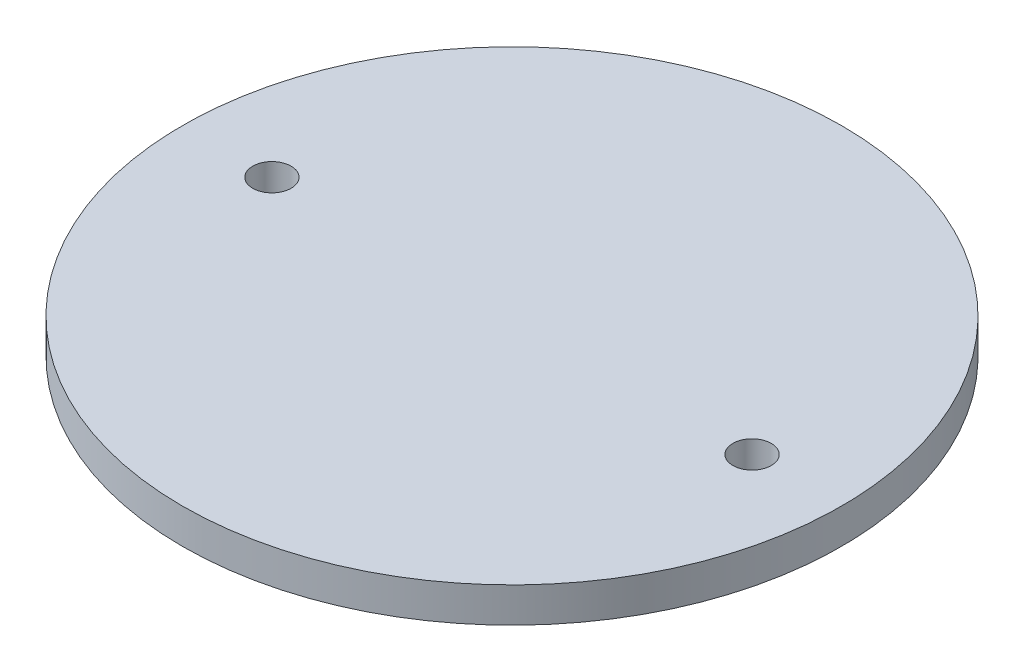
ISO-10303-21;
HEADER;
FILE_DESCRIPTION(('STEP AP214'),'2;1');
FILE_NAME('part.step','',(''),(''),'','','');
FILE_SCHEMA(('AUTOMOTIVE_DESIGN { 1 0 10303 214 1 1 1 1 }'));
ENDSEC;
DATA;
#1=APPLICATION_CONTEXT('core data for automotive mechanical design processes');
#2=APPLICATION_PROTOCOL_DEFINITION('international standard','automotive_design',2000,#1);
#3=PRODUCT_CONTEXT('',#1,'mechanical');
#4=PRODUCT('Part','Part','',(#3));
#5=PRODUCT_RELATED_PRODUCT_CATEGORY('part','',(#4));
#6=PRODUCT_DEFINITION_FORMATION('','',#4);
#7=PRODUCT_DEFINITION_CONTEXT('part definition',#1,'design');
#8=PRODUCT_DEFINITION('design','',#6,#7);
#9=PRODUCT_DEFINITION_SHAPE('','',#8);
#10=(LENGTH_UNIT() NAMED_UNIT(*) SI_UNIT(.MILLI.,.METRE.));
#11=(NAMED_UNIT(*) PLANE_ANGLE_UNIT() SI_UNIT($,.RADIAN.));
#12=(NAMED_UNIT(*) SI_UNIT($,.STERADIAN.) SOLID_ANGLE_UNIT());
#13=UNCERTAINTY_MEASURE_WITH_UNIT(LENGTH_MEASURE(1.E-05),#10,'distance_accuracy_value','');
#14=(GEOMETRIC_REPRESENTATION_CONTEXT(3) GLOBAL_UNCERTAINTY_ASSIGNED_CONTEXT((#13)) GLOBAL_UNIT_ASSIGNED_CONTEXT((#10,
#11,#12)) REPRESENTATION_CONTEXT('',''));
#15=CARTESIAN_POINT('',(0.,0.,0.));
#16=DIRECTION('',(0.,0.,1.));
#17=DIRECTION('',(1.,0.,0.));
#18=AXIS2_PLACEMENT_3D('',#15,#16,#17);
#19=CARTESIAN_POINT('',(0.,4.,0.));
#20=DIRECTION('',(0.,1.,0.));
#21=DIRECTION('',(0.,0.,1.));
#22=AXIS2_PLACEMENT_3D('',#19,#20,#21);
#23=PLANE('',#22);
#24=CARTESIAN_POINT('',(-27.5,4.,0.));
#25=DIRECTION('',(0.,1.,0.));
#26=DIRECTION('',(0.,0.,1.));
#27=AXIS2_PLACEMENT_3D('',#24,#25,#26);
#28=CIRCLE('',#27,2.2);
#29=CARTESIAN_POINT('',(-27.5,4.,2.2));
#30=VERTEX_POINT('',#29);
#31=EDGE_CURVE('E42',#30,#30,#28,.T.);
#32=ORIENTED_EDGE('',*,*,#31,.F.);
#33=EDGE_LOOP('',(#32));
#34=FACE_BOUND('',#33,.T.);
#35=CARTESIAN_POINT('',(0.,4.,0.));
#36=DIRECTION('',(0.,1.,0.));
#37=DIRECTION('',(0.,0.,1.));
#38=AXIS2_PLACEMENT_3D('',#35,#36,#37);
#39=CIRCLE('',#38,37.75);
#40=CARTESIAN_POINT('',(0.,4.,37.75));
#41=VERTEX_POINT('',#40);
#42=EDGE_CURVE('E10',#41,#41,#39,.T.);
#43=ORIENTED_EDGE('',*,*,#42,.T.);
#44=EDGE_LOOP('',(#43));
#45=FACE_BOUND('',#44,.T.);
#46=CARTESIAN_POINT('',(27.5,4.,0.));
#47=DIRECTION('',(0.,1.,0.));
#48=DIRECTION('',(0.,0.,1.));
#49=AXIS2_PLACEMENT_3D('',#46,#47,#48);
#50=CIRCLE('',#49,2.2);
#51=CARTESIAN_POINT('',(27.5,4.,2.19999999999999));
#52=VERTEX_POINT('',#51);
#53=EDGE_CURVE('E47',#52,#52,#50,.T.);
#54=ORIENTED_EDGE('',*,*,#53,.F.);
#55=EDGE_LOOP('',(#54));
#56=FACE_BOUND('',#55,.T.);
#57=ADVANCED_FACE('F31',(#34,#45,#56),#23,.T.);
#58=CARTESIAN_POINT('',(0.,0.,0.));
#59=DIRECTION('',(0.,1.,0.));
#60=DIRECTION('',(0.,0.,1.));
#61=AXIS2_PLACEMENT_3D('',#58,#59,#60);
#62=PLANE('',#61);
#63=CARTESIAN_POINT('',(0.,0.,0.));
#64=DIRECTION('',(0.,1.,0.));
#65=DIRECTION('',(0.,0.,1.));
#66=AXIS2_PLACEMENT_3D('',#63,#64,#65);
#67=CIRCLE('',#66,37.75);
#68=CARTESIAN_POINT('',(0.,0.,37.75));
#69=VERTEX_POINT('',#68);
#70=EDGE_CURVE('E35',#69,#69,#67,.T.);
#71=ORIENTED_EDGE('',*,*,#70,.F.);
#72=EDGE_LOOP('',(#71));
#73=FACE_BOUND('',#72,.T.);
#74=CARTESIAN_POINT('',(-27.5,0.,0.));
#75=DIRECTION('',(0.,1.,0.));
#76=DIRECTION('',(0.,0.,1.));
#77=AXIS2_PLACEMENT_3D('',#74,#75,#76);
#78=CIRCLE('',#77,2.2);
#79=CARTESIAN_POINT('',(-27.5,0.,2.2));
#80=VERTEX_POINT('',#79);
#81=EDGE_CURVE('E44',#80,#80,#78,.T.);
#82=ORIENTED_EDGE('',*,*,#81,.T.);
#83=EDGE_LOOP('',(#82));
#84=FACE_BOUND('',#83,.T.);
#85=CARTESIAN_POINT('',(27.5,0.,0.));
#86=DIRECTION('',(0.,1.,0.));
#87=DIRECTION('',(0.,0.,1.));
#88=AXIS2_PLACEMENT_3D('',#85,#86,#87);
#89=CIRCLE('',#88,2.2);
#90=CARTESIAN_POINT('',(27.5,0.,2.19999999999999));
#91=VERTEX_POINT('',#90);
#92=EDGE_CURVE('E50',#91,#91,#89,.T.);
#93=ORIENTED_EDGE('',*,*,#92,.T.);
#94=EDGE_LOOP('',(#93));
#95=FACE_BOUND('',#94,.T.);
#96=ADVANCED_FACE('F60',(#73,#84,#95),#62,.F.);
#97=CARTESIAN_POINT('',(0.,4.,0.));
#98=DIRECTION('',(0.,-1.,0.));
#99=DIRECTION('',(0.,0.,-1.));
#100=AXIS2_PLACEMENT_3D('',#97,#98,#99);
#101=CYLINDRICAL_SURFACE('',#100,37.75);
#102=ORIENTED_EDGE('',*,*,#42,.F.);
#103=EDGE_LOOP('',(#102));
#104=FACE_BOUND('',#103,.T.);
#105=ORIENTED_EDGE('',*,*,#70,.T.);
#106=EDGE_LOOP('',(#105));
#107=FACE_BOUND('',#106,.T.);
#108=ADVANCED_FACE('F33',(#104,#107),#101,.T.);
#109=CARTESIAN_POINT('',(-27.5,4.,0.));
#110=DIRECTION('',(0.,-1.,0.));
#111=DIRECTION('',(0.,0.,-1.));
#112=AXIS2_PLACEMENT_3D('',#109,#110,#111);
#113=CYLINDRICAL_SURFACE('',#112,2.2);
#114=ORIENTED_EDGE('',*,*,#31,.T.);
#115=EDGE_LOOP('',(#114));
#116=FACE_BOUND('',#115,.T.);
#117=ORIENTED_EDGE('',*,*,#81,.F.);
#118=EDGE_LOOP('',(#117));
#119=FACE_BOUND('',#118,.T.);
#120=ADVANCED_FACE('F69',(#116,#119),#113,.F.);
#121=CARTESIAN_POINT('',(27.5,4.,0.));
#122=DIRECTION('',(0.,-1.,0.));
#123=DIRECTION('',(0.,0.,-1.));
#124=AXIS2_PLACEMENT_3D('',#121,#122,#123);
#125=CYLINDRICAL_SURFACE('',#124,2.2);
#126=ORIENTED_EDGE('',*,*,#53,.T.);
#127=EDGE_LOOP('',(#126));
#128=FACE_BOUND('',#127,.T.);
#129=ORIENTED_EDGE('',*,*,#92,.F.);
#130=EDGE_LOOP('',(#129));
#131=FACE_BOUND('',#130,.T.);
#132=ADVANCED_FACE('F56',(#128,#131),#125,.F.);
#133=CLOSED_SHELL('',(#57,#96,#108,#120,#132));
#134=MANIFOLD_SOLID_BREP('B2',#133);
#135=ADVANCED_BREP_SHAPE_REPRESENTATION('',(#18,#134),#14);
#136=SHAPE_DEFINITION_REPRESENTATION(#9,#135);
ENDSEC;
END-ISO-10303-21;
